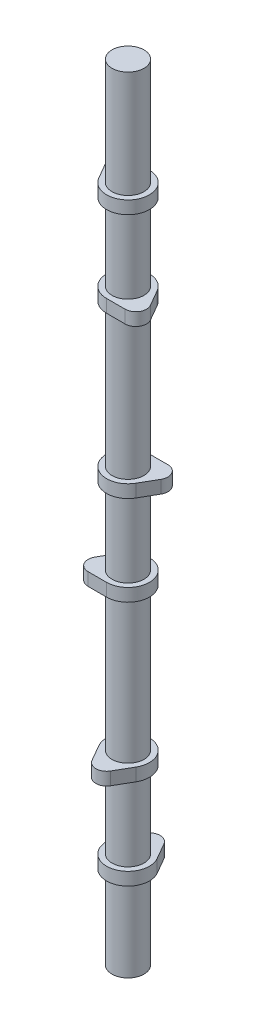
ISO-10303-21;
HEADER;
FILE_DESCRIPTION(('STEP AP214'),'2;1');
FILE_NAME('part.step','',(''),(''),'','','');
FILE_SCHEMA(('AUTOMOTIVE_DESIGN { 1 0 10303 214 1 1 1 1 }'));
ENDSEC;
DATA;
#1=APPLICATION_CONTEXT('core data for automotive mechanical design processes');
#2=APPLICATION_PROTOCOL_DEFINITION('international standard','automotive_design',2000,#1);
#3=PRODUCT_CONTEXT('',#1,'mechanical');
#4=PRODUCT('Part','Part','',(#3));
#5=PRODUCT_RELATED_PRODUCT_CATEGORY('part','',(#4));
#6=PRODUCT_DEFINITION_FORMATION('','',#4);
#7=PRODUCT_DEFINITION_CONTEXT('part definition',#1,'design');
#8=PRODUCT_DEFINITION('design','',#6,#7);
#9=PRODUCT_DEFINITION_SHAPE('','',#8);
#10=(LENGTH_UNIT() NAMED_UNIT(*) SI_UNIT(.MILLI.,.METRE.));
#11=(NAMED_UNIT(*) PLANE_ANGLE_UNIT() SI_UNIT($,.RADIAN.));
#12=(NAMED_UNIT(*) SI_UNIT($,.STERADIAN.) SOLID_ANGLE_UNIT());
#13=UNCERTAINTY_MEASURE_WITH_UNIT(LENGTH_MEASURE(1.E-05),#10,'distance_accuracy_value','');
#14=(GEOMETRIC_REPRESENTATION_CONTEXT(3) GLOBAL_UNCERTAINTY_ASSIGNED_CONTEXT((#13)) GLOBAL_UNIT_ASSIGNED_CONTEXT((#10,
#11,#12)) REPRESENTATION_CONTEXT('',''));
#15=CARTESIAN_POINT('',(0.,0.,0.));
#16=DIRECTION('',(0.,0.,1.));
#17=DIRECTION('',(1.,0.,0.));
#18=AXIS2_PLACEMENT_3D('',#15,#16,#17);
#19=CARTESIAN_POINT('',(0.,412.75,0.));
#20=DIRECTION('',(0.,-1.,0.));
#21=DIRECTION('',(0.,0.,-1.));
#22=AXIS2_PLACEMENT_3D('',#19,#20,#21);
#23=CYLINDRICAL_SURFACE('',#22,9.5);
#24=CARTESIAN_POINT('',(0.,295.91,0.));
#25=DIRECTION('',(0.,1.,0.));
#26=DIRECTION('',(0.,0.,1.));
#27=AXIS2_PLACEMENT_3D('',#24,#25,#26);
#28=CIRCLE('',#27,9.5);
#29=CARTESIAN_POINT('',(0.,295.91,9.5));
#30=VERTEX_POINT('',#29);
#31=EDGE_CURVE('E293',#30,#30,#28,.T.);
#32=ORIENTED_EDGE('',*,*,#31,.T.);
#33=EDGE_LOOP('',(#32));
#34=FACE_BOUND('',#33,.T.);
#35=CARTESIAN_POINT('',(0.,341.63,0.));
#36=DIRECTION('',(0.,1.,0.));
#37=DIRECTION('',(0.,0.,1.));
#38=AXIS2_PLACEMENT_3D('',#35,#36,#37);
#39=CIRCLE('',#38,9.5);
#40=CARTESIAN_POINT('',(0.,341.63,9.5));
#41=VERTEX_POINT('',#40);
#42=EDGE_CURVE('E11',#41,#41,#39,.T.);
#43=ORIENTED_EDGE('',*,*,#42,.F.);
#44=EDGE_LOOP('',(#43));
#45=FACE_BOUND('',#44,.T.);
#46=ADVANCED_FACE('F41',(#34,#45),#23,.T.);
#47=CARTESIAN_POINT('',(0.,203.2,0.));
#48=DIRECTION('',(0.,1.,0.));
#49=DIRECTION('',(0.,0.,1.));
#50=AXIS2_PLACEMENT_3D('',#47,#48,#49);
#51=CIRCLE('',#50,9.5);
#52=CARTESIAN_POINT('',(0.,203.2,9.5));
#53=VERTEX_POINT('',#52);
#54=EDGE_CURVE('E336',#53,#53,#51,.T.);
#55=ORIENTED_EDGE('',*,*,#54,.T.);
#56=EDGE_LOOP('',(#55));
#57=FACE_BOUND('',#56,.T.);
#58=CARTESIAN_POINT('',(0.,288.29,0.));
#59=DIRECTION('',(0.,1.,0.));
#60=DIRECTION('',(0.,0.,1.));
#61=AXIS2_PLACEMENT_3D('',#58,#59,#60);
#62=CIRCLE('',#61,9.5);
#63=CARTESIAN_POINT('',(0.,288.29,9.5));
#64=VERTEX_POINT('',#63);
#65=EDGE_CURVE('E52',#64,#64,#62,.T.);
#66=ORIENTED_EDGE('',*,*,#65,.F.);
#67=EDGE_LOOP('',(#66));
#68=FACE_BOUND('',#67,.T.);
#69=ADVANCED_FACE('F535',(#57,#68),#23,.T.);
#70=CARTESIAN_POINT('',(0.,149.86,0.));
#71=DIRECTION('',(0.,1.,0.));
#72=DIRECTION('',(0.,0.,1.));
#73=AXIS2_PLACEMENT_3D('',#70,#71,#72);
#74=CIRCLE('',#73,9.5);
#75=CARTESIAN_POINT('',(0.,149.86,9.5));
#76=VERTEX_POINT('',#75);
#77=EDGE_CURVE('E379',#76,#76,#74,.T.);
#78=ORIENTED_EDGE('',*,*,#77,.T.);
#79=EDGE_LOOP('',(#78));
#80=FACE_BOUND('',#79,.T.);
#81=CARTESIAN_POINT('',(0.,195.58,0.));
#82=DIRECTION('',(0.,1.,0.));
#83=DIRECTION('',(0.,0.,1.));
#84=AXIS2_PLACEMENT_3D('',#81,#82,#83);
#85=CIRCLE('',#84,9.5);
#86=CARTESIAN_POINT('',(0.,195.58,9.5));
#87=VERTEX_POINT('',#86);
#88=EDGE_CURVE('E483',#87,#87,#85,.T.);
#89=ORIENTED_EDGE('',*,*,#88,.F.);
#90=EDGE_LOOP('',(#89));
#91=FACE_BOUND('',#90,.T.);
#92=ADVANCED_FACE('F541',(#80,#91),#23,.T.);
#93=CARTESIAN_POINT('',(0.,57.15,0.));
#94=DIRECTION('',(0.,1.,0.));
#95=DIRECTION('',(0.,0.,1.));
#96=AXIS2_PLACEMENT_3D('',#93,#94,#95);
#97=CIRCLE('',#96,9.5);
#98=CARTESIAN_POINT('',(0.,57.15,9.5));
#99=VERTEX_POINT('',#98);
#100=EDGE_CURVE('E422',#99,#99,#97,.T.);
#101=ORIENTED_EDGE('',*,*,#100,.T.);
#102=EDGE_LOOP('',(#101));
#103=FACE_BOUND('',#102,.T.);
#104=CARTESIAN_POINT('',(0.,142.24,0.));
#105=DIRECTION('',(0.,1.,0.));
#106=DIRECTION('',(0.,0.,1.));
#107=AXIS2_PLACEMENT_3D('',#104,#105,#106);
#108=CIRCLE('',#107,9.5);
#109=CARTESIAN_POINT('',(0.,142.24,9.5));
#110=VERTEX_POINT('',#109);
#111=EDGE_CURVE('E476',#110,#110,#108,.T.);
#112=ORIENTED_EDGE('',*,*,#111,.F.);
#113=EDGE_LOOP('',(#112));
#114=FACE_BOUND('',#113,.T.);
#115=ADVANCED_FACE('F572',(#103,#114),#23,.T.);
#116=CARTESIAN_POINT('',(0.,3.80999999999998,0.));
#117=DIRECTION('',(0.,1.,0.));
#118=DIRECTION('',(0.,0.,1.));
#119=AXIS2_PLACEMENT_3D('',#116,#117,#118);
#120=CIRCLE('',#119,9.5);
#121=CARTESIAN_POINT('',(0.,3.80999999999998,9.5));
#122=VERTEX_POINT('',#121);
#123=EDGE_CURVE('E427',#122,#122,#120,.F.);
#124=ORIENTED_EDGE('',*,*,#123,.F.);
#125=EDGE_LOOP('',(#124));
#126=FACE_BOUND('',#125,.T.);
#127=CARTESIAN_POINT('',(0.,49.53,0.));
#128=DIRECTION('',(0.,1.,0.));
#129=DIRECTION('',(0.,0.,1.));
#130=AXIS2_PLACEMENT_3D('',#127,#128,#129);
#131=CIRCLE('',#130,9.5);
#132=CARTESIAN_POINT('',(0.,49.53,9.5));
#133=VERTEX_POINT('',#132);
#134=EDGE_CURVE('E472',#133,#133,#131,.T.);
#135=ORIENTED_EDGE('',*,*,#134,.F.);
#136=EDGE_LOOP('',(#135));
#137=FACE_BOUND('',#136,.T.);
#138=ADVANCED_FACE('F560',(#126,#137),#23,.T.);
#139=CARTESIAN_POINT('',(0.,3.81,-12.7));
#140=DIRECTION('',(0.,-1.,0.));
#141=DIRECTION('',(0.,0.,-1.));
#142=AXIS2_PLACEMENT_3D('',#139,#140,#141);
#143=CYLINDRICAL_SURFACE('',#142,6.35);
#144=CARTESIAN_POINT('',(0.,-3.81,-12.7));
#145=DIRECTION('',(0.,1.,0.));
#146=DIRECTION('',(0.,0.,1.));
#147=AXIS2_PLACEMENT_3D('',#144,#145,#146);
#148=CIRCLE('',#147,6.35);
#149=CARTESIAN_POINT('',(5.49926131403118,-3.81,-15.875));
#150=VERTEX_POINT('',#149);
#151=CARTESIAN_POINT('',(-5.49926131403118,-3.81,-15.875));
#152=VERTEX_POINT('',#151);
#153=EDGE_CURVE('E435',#150,#152,#148,.T.);
#154=ORIENTED_EDGE('',*,*,#153,.T.);
#155=DIRECTION('',(0.,-1.,0.));
#156=VECTOR('',#155,1.);
#157=CARTESIAN_POINT('',(-5.49926131403118,3.81,-15.875));
#158=LINE('',#157,#156);
#159=CARTESIAN_POINT('',(-5.49926131403118,3.81,-15.875));
#160=VERTEX_POINT('',#159);
#161=EDGE_CURVE('E465',#160,#152,#158,.T.);
#162=ORIENTED_EDGE('',*,*,#161,.F.);
#163=CARTESIAN_POINT('',(0.,3.81,-12.7));
#164=DIRECTION('',(0.,1.,0.));
#165=DIRECTION('',(0.,0.,1.));
#166=AXIS2_PLACEMENT_3D('',#163,#164,#165);
#167=CIRCLE('',#166,6.35);
#168=CARTESIAN_POINT('',(5.49926131403118,3.81,-15.875));
#169=VERTEX_POINT('',#168);
#170=EDGE_CURVE('E436',#169,#160,#167,.T.);
#171=ORIENTED_EDGE('',*,*,#170,.F.);
#172=DIRECTION('',(0.,-1.,0.));
#173=VECTOR('',#172,1.);
#174=CARTESIAN_POINT('',(5.49926131403118,3.81,-15.875));
#175=LINE('',#174,#173);
#176=EDGE_CURVE('E446',#169,#150,#175,.T.);
#177=ORIENTED_EDGE('',*,*,#176,.T.);
#178=EDGE_LOOP('',(#154,#162,#171,#177));
#179=FACE_BOUND('',#178,.T.);
#180=ADVANCED_FACE('F43',(#179),#143,.T.);
#181=CARTESIAN_POINT('',(-5.49926131403118,3.81,-15.875));
#182=DIRECTION('',(0.866025403784439,0.,0.5));
#183=DIRECTION('',(0.5,0.,-0.866025403784439));
#184=AXIS2_PLACEMENT_3D('',#181,#182,#183);
#185=PLANE('',#184);
#186=DIRECTION('',(-0.5,0.,0.866025403784439));
#187=VECTOR('',#186,1.);
#188=CARTESIAN_POINT('',(-5.49926131403118,-3.81,-15.875));
#189=LINE('',#188,#187);
#190=CARTESIAN_POINT('',(-10.9985226280624,-3.81,-6.35));
#191=VERTEX_POINT('',#190);
#192=EDGE_CURVE('E450',#152,#191,#189,.T.);
#193=ORIENTED_EDGE('',*,*,#192,.T.);
#194=DIRECTION('',(0.,-1.,0.));
#195=VECTOR('',#194,1.);
#196=CARTESIAN_POINT('',(-10.9985226280624,3.81,-6.35));
#197=LINE('',#196,#195);
#198=CARTESIAN_POINT('',(-10.9985226280624,3.81,-6.35));
#199=VERTEX_POINT('',#198);
#200=EDGE_CURVE('E462',#199,#191,#197,.T.);
#201=ORIENTED_EDGE('',*,*,#200,.F.);
#202=DIRECTION('',(-0.5,0.,0.866025403784439));
#203=VECTOR('',#202,1.);
#204=CARTESIAN_POINT('',(-5.49926131403118,3.81,-15.875));
#205=LINE('',#204,#203);
#206=EDGE_CURVE('E92',#160,#199,#205,.T.);
#207=ORIENTED_EDGE('',*,*,#206,.F.);
#208=ORIENTED_EDGE('',*,*,#161,.T.);
#209=EDGE_LOOP('',(#193,#201,#207,#208));
#210=FACE_BOUND('',#209,.T.);
#211=ADVANCED_FACE('F578',(#210),#185,.F.);
#212=CARTESIAN_POINT('',(0.,3.81,0.));
#213=DIRECTION('',(0.,-1.,0.));
#214=DIRECTION('',(0.,0.,-1.));
#215=AXIS2_PLACEMENT_3D('',#212,#213,#214);
#216=CYLINDRICAL_SURFACE('',#215,12.7);
#217=CARTESIAN_POINT('',(0.,-3.81,0.));
#218=DIRECTION('',(0.,1.,0.));
#219=DIRECTION('',(0.,0.,1.));
#220=AXIS2_PLACEMENT_3D('',#217,#218,#219);
#221=CIRCLE('',#220,12.7);
#222=CARTESIAN_POINT('',(10.9985226280624,-3.81,-6.34999999999999));
#223=VERTEX_POINT('',#222);
#224=EDGE_CURVE('E78',#191,#223,#221,.T.);
#225=ORIENTED_EDGE('',*,*,#224,.T.);
#226=DIRECTION('',(0.,-1.,0.));
#227=VECTOR('',#226,1.);
#228=CARTESIAN_POINT('',(10.9985226280624,3.81,-6.34999999999999));
#229=LINE('',#228,#227);
#230=CARTESIAN_POINT('',(10.9985226280624,3.81,-6.34999999999999));
#231=VERTEX_POINT('',#230);
#232=EDGE_CURVE('E459',#231,#223,#229,.T.);
#233=ORIENTED_EDGE('',*,*,#232,.F.);
#234=CARTESIAN_POINT('',(0.,3.81,0.));
#235=DIRECTION('',(0.,1.,0.));
#236=DIRECTION('',(0.,0.,1.));
#237=AXIS2_PLACEMENT_3D('',#234,#235,#236);
#238=CIRCLE('',#237,12.7);
#239=EDGE_CURVE('E441',#199,#231,#238,.T.);
#240=ORIENTED_EDGE('',*,*,#239,.F.);
#241=ORIENTED_EDGE('',*,*,#200,.T.);
#242=EDGE_LOOP('',(#225,#233,#240,#241));
#243=FACE_BOUND('',#242,.T.);
#244=ADVANCED_FACE('F910',(#243),#216,.T.);
#245=CARTESIAN_POINT('',(5.49926131403118,3.81,-15.875));
#246=DIRECTION('',(-0.866025403784439,0.,0.5));
#247=DIRECTION('',(0.5,0.,0.866025403784439));
#248=AXIS2_PLACEMENT_3D('',#245,#246,#247);
#249=PLANE('',#248);
#250=DIRECTION('',(-0.5,0.,-0.866025403784439));
#251=VECTOR('',#250,1.);
#252=CARTESIAN_POINT('',(5.49926131403118,-3.81,-15.875));
#253=LINE('',#252,#251);
#254=EDGE_CURVE('E84',#223,#150,#253,.T.);
#255=ORIENTED_EDGE('',*,*,#254,.T.);
#256=ORIENTED_EDGE('',*,*,#176,.F.);
#257=DIRECTION('',(-0.5,0.,-0.866025403784439));
#258=VECTOR('',#257,1.);
#259=CARTESIAN_POINT('',(5.49926131403118,3.81,-15.875));
#260=LINE('',#259,#258);
#261=EDGE_CURVE('E60',#231,#169,#260,.T.);
#262=ORIENTED_EDGE('',*,*,#261,.F.);
#263=ORIENTED_EDGE('',*,*,#232,.T.);
#264=EDGE_LOOP('',(#255,#256,#262,#263));
#265=FACE_BOUND('',#264,.T.);
#266=ADVANCED_FACE('F904',(#265),#249,.F.);
#267=CARTESIAN_POINT('',(0.,3.81,-12.7));
#268=DIRECTION('',(0.,1.,0.));
#269=DIRECTION('',(0.,0.,1.));
#270=AXIS2_PLACEMENT_3D('',#267,#268,#269);
#271=PLANE('',#270);
#272=ORIENTED_EDGE('',*,*,#123,.T.);
#273=EDGE_LOOP('',(#272));
#274=FACE_BOUND('',#273,.T.);
#275=ORIENTED_EDGE('',*,*,#170,.T.);
#276=ORIENTED_EDGE('',*,*,#206,.T.);
#277=ORIENTED_EDGE('',*,*,#239,.T.);
#278=ORIENTED_EDGE('',*,*,#261,.T.);
#279=EDGE_LOOP('',(#275,#276,#277,#278));
#280=FACE_BOUND('',#279,.T.);
#281=ADVANCED_FACE('F909',(#274,#280),#271,.T.);
#282=CARTESIAN_POINT('',(0.,-3.81,-12.7));
#283=DIRECTION('',(0.,1.,0.));
#284=DIRECTION('',(0.,0.,1.));
#285=AXIS2_PLACEMENT_3D('',#282,#283,#284);
#286=PLANE('',#285);
#287=CARTESIAN_POINT('',(0.,-3.80999999999998,0.));
#288=DIRECTION('',(0.,1.,0.));
#289=DIRECTION('',(0.,0.,1.));
#290=AXIS2_PLACEMENT_3D('',#287,#288,#289);
#291=CIRCLE('',#290,9.5);
#292=CARTESIAN_POINT('',(0.,-3.80999999999998,9.5));
#293=VERTEX_POINT('',#292);
#294=EDGE_CURVE('E468',#293,#293,#291,.F.);
#295=ORIENTED_EDGE('',*,*,#294,.F.);
#296=EDGE_LOOP('',(#295));
#297=FACE_BOUND('',#296,.T.);
#298=ORIENTED_EDGE('',*,*,#153,.F.);
#299=ORIENTED_EDGE('',*,*,#254,.F.);
#300=ORIENTED_EDGE('',*,*,#224,.F.);
#301=ORIENTED_EDGE('',*,*,#192,.F.);
#302=EDGE_LOOP('',(#298,#299,#300,#301));
#303=FACE_BOUND('',#302,.T.);
#304=ADVANCED_FACE('F568',(#297,#303),#286,.F.);
#305=CARTESIAN_POINT('',(0.,-53.34,0.));
#306=DIRECTION('',(0.,1.,0.));
#307=DIRECTION('',(0.,0.,1.));
#308=AXIS2_PLACEMENT_3D('',#305,#306,#307);
#309=PLANE('',#308);
#310=CARTESIAN_POINT('',(0.,-53.34,0.));
#311=DIRECTION('',(0.,1.,0.));
#312=DIRECTION('',(0.,0.,1.));
#313=AXIS2_PLACEMENT_3D('',#310,#311,#312);
#314=CIRCLE('',#313,9.5);
#315=CARTESIAN_POINT('',(0.,-53.34,9.5));
#316=VERTEX_POINT('',#315);
#317=EDGE_CURVE('E428',#316,#316,#314,.T.);
#318=ORIENTED_EDGE('',*,*,#317,.F.);
#319=EDGE_LOOP('',(#318));
#320=FACE_BOUND('',#319,.T.);
#321=ADVANCED_FACE('F558',(#320),#309,.F.);
#322=ORIENTED_EDGE('',*,*,#317,.T.);
#323=EDGE_LOOP('',(#322));
#324=FACE_BOUND('',#323,.T.);
#325=ORIENTED_EDGE('',*,*,#294,.T.);
#326=EDGE_LOOP('',(#325));
#327=FACE_BOUND('',#326,.T.);
#328=ADVANCED_FACE('F548',(#324,#327),#23,.T.);
#329=CARTESIAN_POINT('',(0.,57.15,12.7));
#330=DIRECTION('',(0.,-1.,0.));
#331=DIRECTION('',(0.,0.,1.));
#332=AXIS2_PLACEMENT_3D('',#329,#330,#331);
#333=CYLINDRICAL_SURFACE('',#332,6.35);
#334=CARTESIAN_POINT('',(0.,49.53,12.7));
#335=DIRECTION('',(0.,1.,0.));
#336=DIRECTION('',(0.,0.,-1.));
#337=AXIS2_PLACEMENT_3D('',#334,#335,#336);
#338=CIRCLE('',#337,6.35);
#339=CARTESIAN_POINT('',(-5.49926131403129,49.53,15.875));
#340=VERTEX_POINT('',#339);
#341=CARTESIAN_POINT('',(5.49926131403107,49.53,15.875));
#342=VERTEX_POINT('',#341);
#343=EDGE_CURVE('E395',#340,#342,#338,.T.);
#344=ORIENTED_EDGE('',*,*,#343,.T.);
#345=DIRECTION('',(0.,-1.,0.));
#346=VECTOR('',#345,1.);
#347=CARTESIAN_POINT('',(5.49926131403107,57.15,15.875));
#348=LINE('',#347,#346);
#349=CARTESIAN_POINT('',(5.49926131403107,57.15,15.875));
#350=VERTEX_POINT('',#349);
#351=EDGE_CURVE('E418',#350,#342,#348,.T.);
#352=ORIENTED_EDGE('',*,*,#351,.F.);
#353=CARTESIAN_POINT('',(0.,57.15,12.7));
#354=DIRECTION('',(0.,1.,0.));
#355=DIRECTION('',(0.,0.,-1.));
#356=AXIS2_PLACEMENT_3D('',#353,#354,#355);
#357=CIRCLE('',#356,6.35);
#358=CARTESIAN_POINT('',(-5.49926131403129,57.15,15.875));
#359=VERTEX_POINT('',#358);
#360=EDGE_CURVE('E380',#359,#350,#357,.T.);
#361=ORIENTED_EDGE('',*,*,#360,.F.);
#362=DIRECTION('',(0.,-1.,0.));
#363=VECTOR('',#362,1.);
#364=CARTESIAN_POINT('',(-5.49926131403129,57.15,15.875));
#365=LINE('',#364,#363);
#366=EDGE_CURVE('E394',#359,#340,#365,.T.);
#367=ORIENTED_EDGE('',*,*,#366,.T.);
#368=EDGE_LOOP('',(#344,#352,#361,#367));
#369=FACE_BOUND('',#368,.T.);
#370=ADVANCED_FACE('F557',(#369),#333,.T.);
#371=CARTESIAN_POINT('',(5.49926131403107,57.15,15.875));
#372=DIRECTION('',(-0.866025403784435,0.,-0.500000000000006));
#373=DIRECTION('',(-0.500000000000006,0.,0.866025403784435));
#374=AXIS2_PLACEMENT_3D('',#371,#372,#373);
#375=PLANE('',#374);
#376=DIRECTION('',(0.500000000000006,0.,-0.866025403784435));
#377=VECTOR('',#376,1.);
#378=CARTESIAN_POINT('',(5.49926131403107,49.53,15.875));
#379=LINE('',#378,#377);
#380=CARTESIAN_POINT('',(10.9985226280623,49.53,6.35000000000007));
#381=VERTEX_POINT('',#380);
#382=EDGE_CURVE('E399',#342,#381,#379,.T.);
#383=ORIENTED_EDGE('',*,*,#382,.T.);
#384=DIRECTION('',(0.,-1.,0.));
#385=VECTOR('',#384,1.);
#386=CARTESIAN_POINT('',(10.9985226280623,57.15,6.35000000000007));
#387=LINE('',#386,#385);
#388=CARTESIAN_POINT('',(10.9985226280623,57.15,6.35000000000007));
#389=VERTEX_POINT('',#388);
#390=EDGE_CURVE('E414',#389,#381,#387,.T.);
#391=ORIENTED_EDGE('',*,*,#390,.F.);
#392=DIRECTION('',(0.500000000000006,0.,-0.866025403784435));
#393=VECTOR('',#392,1.);
#394=CARTESIAN_POINT('',(5.49926131403107,57.15,15.875));
#395=LINE('',#394,#393);
#396=EDGE_CURVE('E384',#350,#389,#395,.T.);
#397=ORIENTED_EDGE('',*,*,#396,.F.);
#398=ORIENTED_EDGE('',*,*,#351,.T.);
#399=EDGE_LOOP('',(#383,#391,#397,#398));
#400=FACE_BOUND('',#399,.T.);
#401=ADVANCED_FACE('F565',(#400),#375,.F.);
#402=CARTESIAN_POINT('',(0.,57.15,0.));
#403=DIRECTION('',(0.,-1.,0.));
#404=DIRECTION('',(0.,0.,1.));
#405=AXIS2_PLACEMENT_3D('',#402,#403,#404);
#406=CYLINDRICAL_SURFACE('',#405,12.7);
#407=CARTESIAN_POINT('',(0.,49.53,0.));
#408=DIRECTION('',(0.,1.,0.));
#409=DIRECTION('',(0.,0.,-1.));
#410=AXIS2_PLACEMENT_3D('',#407,#408,#409);
#411=CIRCLE('',#410,12.7);
#412=CARTESIAN_POINT('',(-10.9985226280624,49.53,6.34999999999991));
#413=VERTEX_POINT('',#412);
#414=EDGE_CURVE('E402',#381,#413,#411,.T.);
#415=ORIENTED_EDGE('',*,*,#414,.T.);
#416=DIRECTION('',(0.,-1.,0.));
#417=VECTOR('',#416,1.);
#418=CARTESIAN_POINT('',(-10.9985226280624,57.15,6.34999999999991));
#419=LINE('',#418,#417);
#420=CARTESIAN_POINT('',(-10.9985226280624,57.15,6.34999999999991));
#421=VERTEX_POINT('',#420);
#422=EDGE_CURVE('E410',#421,#413,#419,.T.);
#423=ORIENTED_EDGE('',*,*,#422,.F.);
#424=CARTESIAN_POINT('',(0.,57.15,0.));
#425=DIRECTION('',(0.,1.,0.));
#426=DIRECTION('',(0.,0.,-1.));
#427=AXIS2_PLACEMENT_3D('',#424,#425,#426);
#428=CIRCLE('',#427,12.7);
#429=EDGE_CURVE('E388',#389,#421,#428,.T.);
#430=ORIENTED_EDGE('',*,*,#429,.F.);
#431=ORIENTED_EDGE('',*,*,#390,.T.);
#432=EDGE_LOOP('',(#415,#423,#430,#431));
#433=FACE_BOUND('',#432,.T.);
#434=ADVANCED_FACE('F603',(#433),#406,.T.);
#435=CARTESIAN_POINT('',(-5.49926131403129,57.15,15.875));
#436=DIRECTION('',(0.866025403784442,0.,-0.499999999999994));
#437=DIRECTION('',(-0.499999999999994,0.,-0.866025403784442));
#438=AXIS2_PLACEMENT_3D('',#435,#436,#437);
#439=PLANE('',#438);
#440=DIRECTION('',(0.499999999999994,0.,0.866025403784442));
#441=VECTOR('',#440,1.);
#442=CARTESIAN_POINT('',(-5.49926131403129,49.53,15.875));
#443=LINE('',#442,#441);
#444=EDGE_CURVE('E385',#413,#340,#443,.T.);
#445=ORIENTED_EDGE('',*,*,#444,.T.);
#446=ORIENTED_EDGE('',*,*,#366,.F.);
#447=DIRECTION('',(0.499999999999994,0.,0.866025403784442));
#448=VECTOR('',#447,1.);
#449=CARTESIAN_POINT('',(-5.49926131403129,57.15,15.875));
#450=LINE('',#449,#448);
#451=EDGE_CURVE('E391',#421,#359,#450,.T.);
#452=ORIENTED_EDGE('',*,*,#451,.F.);
#453=ORIENTED_EDGE('',*,*,#422,.T.);
#454=EDGE_LOOP('',(#445,#446,#452,#453));
#455=FACE_BOUND('',#454,.T.);
#456=ADVANCED_FACE('F599',(#455),#439,.F.);
#457=CARTESIAN_POINT('',(0.,57.15,12.7));
#458=DIRECTION('',(0.,1.,0.));
#459=DIRECTION('',(0.,0.,-1.));
#460=AXIS2_PLACEMENT_3D('',#457,#458,#459);
#461=PLANE('',#460);
#462=ORIENTED_EDGE('',*,*,#100,.F.);
#463=EDGE_LOOP('',(#462));
#464=FACE_BOUND('',#463,.T.);
#465=ORIENTED_EDGE('',*,*,#360,.T.);
#466=ORIENTED_EDGE('',*,*,#396,.T.);
#467=ORIENTED_EDGE('',*,*,#429,.T.);
#468=ORIENTED_EDGE('',*,*,#451,.T.);
#469=EDGE_LOOP('',(#465,#466,#467,#468));
#470=FACE_BOUND('',#469,.T.);
#471=ADVANCED_FACE('F589',(#464,#470),#461,.T.);
#472=CARTESIAN_POINT('',(0.,49.53,12.7));
#473=DIRECTION('',(0.,1.,0.));
#474=DIRECTION('',(0.,0.,-1.));
#475=AXIS2_PLACEMENT_3D('',#472,#473,#474);
#476=PLANE('',#475);
#477=ORIENTED_EDGE('',*,*,#134,.T.);
#478=EDGE_LOOP('',(#477));
#479=FACE_BOUND('',#478,.T.);
#480=ORIENTED_EDGE('',*,*,#343,.F.);
#481=ORIENTED_EDGE('',*,*,#444,.F.);
#482=ORIENTED_EDGE('',*,*,#414,.F.);
#483=ORIENTED_EDGE('',*,*,#382,.F.);
#484=EDGE_LOOP('',(#480,#481,#482,#483));
#485=FACE_BOUND('',#484,.T.);
#486=ADVANCED_FACE('F585',(#479,#485),#476,.F.);
#487=CARTESIAN_POINT('',(-10.9985226280623,149.86,6.35000000000005));
#488=DIRECTION('',(0.,-1.,0.));
#489=DIRECTION('',(-0.866025403784436,0.,0.500000000000004));
#490=AXIS2_PLACEMENT_3D('',#487,#488,#489);
#491=CYLINDRICAL_SURFACE('',#490,6.35);
#492=CARTESIAN_POINT('',(-10.9985226280623,142.24,6.35000000000005));
#493=DIRECTION('',(0.,1.,0.));
#494=DIRECTION('',(0.866025403784436,0.,-0.500000000000004));
#495=AXIS2_PLACEMENT_3D('',#492,#493,#494);
#496=CIRCLE('',#495,6.35);
#497=CARTESIAN_POINT('',(-16.4977839420935,142.24,3.17500000000008));
#498=VERTEX_POINT('',#497);
#499=CARTESIAN_POINT('',(-10.9985226280623,142.24,12.7000000000001));
#500=VERTEX_POINT('',#499);
#501=EDGE_CURVE('E352',#498,#500,#496,.T.);
#502=ORIENTED_EDGE('',*,*,#501,.T.);
#503=DIRECTION('',(0.,-1.,0.));
#504=VECTOR('',#503,1.);
#505=CARTESIAN_POINT('',(-10.9985226280623,149.86,12.7000000000001));
#506=LINE('',#505,#504);
#507=CARTESIAN_POINT('',(-10.9985226280623,149.86,12.7000000000001));
#508=VERTEX_POINT('',#507);
#509=EDGE_CURVE('E375',#508,#500,#506,.T.);
#510=ORIENTED_EDGE('',*,*,#509,.F.);
#511=CARTESIAN_POINT('',(-10.9985226280623,149.86,6.35000000000005));
#512=DIRECTION('',(0.,1.,0.));
#513=DIRECTION('',(0.866025403784436,0.,-0.500000000000004));
#514=AXIS2_PLACEMENT_3D('',#511,#512,#513);
#515=CIRCLE('',#514,6.35);
#516=CARTESIAN_POINT('',(-16.4977839420935,149.86,3.17500000000008));
#517=VERTEX_POINT('',#516);
#518=EDGE_CURVE('E337',#517,#508,#515,.T.);
#519=ORIENTED_EDGE('',*,*,#518,.F.);
#520=DIRECTION('',(0.,-1.,0.));
#521=VECTOR('',#520,1.);
#522=CARTESIAN_POINT('',(-16.4977839420935,149.86,3.17500000000008));
#523=LINE('',#522,#521);
#524=EDGE_CURVE('E351',#517,#498,#523,.T.);
#525=ORIENTED_EDGE('',*,*,#524,.T.);
#526=EDGE_LOOP('',(#502,#510,#519,#525));
#527=FACE_BOUND('',#526,.T.);
#528=ADVANCED_FACE('F588',(#527),#491,.T.);
#529=CARTESIAN_POINT('',(-10.9985226280623,149.86,12.7000000000001));
#530=DIRECTION('',(0.,0.,-1.));
#531=DIRECTION('',(-1.,0.,0.));
#532=AXIS2_PLACEMENT_3D('',#529,#530,#531);
#533=PLANE('',#532);
#534=DIRECTION('',(1.,0.,0.));
#535=VECTOR('',#534,1.);
#536=CARTESIAN_POINT('',(-10.9985226280623,142.24,12.7000000000001));
#537=LINE('',#536,#535);
#538=CARTESIAN_POINT('',(0.,142.24,12.7));
#539=VERTEX_POINT('',#538);
#540=EDGE_CURVE('E356',#500,#539,#537,.T.);
#541=ORIENTED_EDGE('',*,*,#540,.T.);
#542=DIRECTION('',(0.,-1.,0.));
#543=VECTOR('',#542,1.);
#544=CARTESIAN_POINT('',(0.,149.86,12.7));
#545=LINE('',#544,#543);
#546=CARTESIAN_POINT('',(0.,149.86,12.7));
#547=VERTEX_POINT('',#546);
#548=EDGE_CURVE('E371',#547,#539,#545,.T.);
#549=ORIENTED_EDGE('',*,*,#548,.F.);
#550=DIRECTION('',(1.,0.,0.));
#551=VECTOR('',#550,1.);
#552=CARTESIAN_POINT('',(-10.9985226280623,149.86,12.7000000000001));
#553=LINE('',#552,#551);
#554=EDGE_CURVE('E341',#508,#547,#553,.T.);
#555=ORIENTED_EDGE('',*,*,#554,.F.);
#556=ORIENTED_EDGE('',*,*,#509,.T.);
#557=EDGE_LOOP('',(#541,#549,#555,#556));
#558=FACE_BOUND('',#557,.T.);
#559=ADVANCED_FACE('F652',(#558),#533,.F.);
#560=CARTESIAN_POINT('',(0.,149.86,0.));
#561=DIRECTION('',(0.,-1.,0.));
#562=DIRECTION('',(-0.866025403784436,0.,0.500000000000004));
#563=AXIS2_PLACEMENT_3D('',#560,#561,#562);
#564=CYLINDRICAL_SURFACE('',#563,12.7);
#565=CARTESIAN_POINT('',(0.,142.24,0.));
#566=DIRECTION('',(0.,1.,0.));
#567=DIRECTION('',(0.866025403784436,0.,-0.500000000000004));
#568=AXIS2_PLACEMENT_3D('',#565,#566,#567);
#569=CIRCLE('',#568,12.7);
#570=CARTESIAN_POINT('',(-10.9985226280624,142.24,-6.34999999999996));
#571=VERTEX_POINT('',#570);
#572=EDGE_CURVE('E359',#539,#571,#569,.T.);
#573=ORIENTED_EDGE('',*,*,#572,.T.);
#574=DIRECTION('',(0.,-1.,0.));
#575=VECTOR('',#574,1.);
#576=CARTESIAN_POINT('',(-10.9985226280624,149.86,-6.34999999999996));
#577=LINE('',#576,#575);
#578=CARTESIAN_POINT('',(-10.9985226280624,149.86,-6.34999999999996));
#579=VERTEX_POINT('',#578);
#580=EDGE_CURVE('E367',#579,#571,#577,.T.);
#581=ORIENTED_EDGE('',*,*,#580,.F.);
#582=CARTESIAN_POINT('',(0.,149.86,0.));
#583=DIRECTION('',(0.,1.,0.));
#584=DIRECTION('',(0.866025403784436,0.,-0.500000000000004));
#585=AXIS2_PLACEMENT_3D('',#582,#583,#584);
#586=CIRCLE('',#585,12.7);
#587=EDGE_CURVE('E345',#547,#579,#586,.T.);
#588=ORIENTED_EDGE('',*,*,#587,.F.);
#589=ORIENTED_EDGE('',*,*,#548,.T.);
#590=EDGE_LOOP('',(#573,#581,#588,#589));
#591=FACE_BOUND('',#590,.T.);
#592=ADVANCED_FACE('F661',(#591),#564,.T.);
#593=CARTESIAN_POINT('',(-16.4977839420935,149.86,3.17500000000008));
#594=DIRECTION('',(0.866025403784441,0.,0.499999999999996));
#595=DIRECTION('',(0.499999999999996,0.,-0.866025403784441));
#596=AXIS2_PLACEMENT_3D('',#593,#594,#595);
#597=PLANE('',#596);
#598=DIRECTION('',(-0.499999999999996,0.,0.866025403784441));
#599=VECTOR('',#598,1.);
#600=CARTESIAN_POINT('',(-16.4977839420935,142.24,3.17500000000008));
#601=LINE('',#600,#599);
#602=EDGE_CURVE('E342',#571,#498,#601,.T.);
#603=ORIENTED_EDGE('',*,*,#602,.T.);
#604=ORIENTED_EDGE('',*,*,#524,.F.);
#605=DIRECTION('',(-0.499999999999996,0.,0.866025403784441));
#606=VECTOR('',#605,1.);
#607=CARTESIAN_POINT('',(-16.4977839420935,149.86,3.17500000000008));
#608=LINE('',#607,#606);
#609=EDGE_CURVE('E348',#579,#517,#608,.T.);
#610=ORIENTED_EDGE('',*,*,#609,.F.);
#611=ORIENTED_EDGE('',*,*,#580,.T.);
#612=EDGE_LOOP('',(#603,#604,#610,#611));
#613=FACE_BOUND('',#612,.T.);
#614=ADVANCED_FACE('F670',(#613),#597,.F.);
#615=CARTESIAN_POINT('',(-10.9985226280623,149.86,6.35000000000005));
#616=DIRECTION('',(0.,1.,0.));
#617=DIRECTION('',(0.866025403784436,0.,-0.500000000000004));
#618=AXIS2_PLACEMENT_3D('',#615,#616,#617);
#619=PLANE('',#618);
#620=ORIENTED_EDGE('',*,*,#77,.F.);
#621=EDGE_LOOP('',(#620));
#622=FACE_BOUND('',#621,.T.);
#623=ORIENTED_EDGE('',*,*,#518,.T.);
#624=ORIENTED_EDGE('',*,*,#554,.T.);
#625=ORIENTED_EDGE('',*,*,#587,.T.);
#626=ORIENTED_EDGE('',*,*,#609,.T.);
#627=EDGE_LOOP('',(#623,#624,#625,#626));
#628=FACE_BOUND('',#627,.T.);
#629=ADVANCED_FACE('F680',(#622,#628),#619,.T.);
#630=CARTESIAN_POINT('',(-10.9985226280623,142.24,6.35000000000005));
#631=DIRECTION('',(0.,1.,0.));
#632=DIRECTION('',(0.866025403784436,0.,-0.500000000000004));
#633=AXIS2_PLACEMENT_3D('',#630,#631,#632);
#634=PLANE('',#633);
#635=ORIENTED_EDGE('',*,*,#111,.T.);
#636=EDGE_LOOP('',(#635));
#637=FACE_BOUND('',#636,.T.);
#638=ORIENTED_EDGE('',*,*,#501,.F.);
#639=ORIENTED_EDGE('',*,*,#602,.F.);
#640=ORIENTED_EDGE('',*,*,#572,.F.);
#641=ORIENTED_EDGE('',*,*,#540,.F.);
#642=EDGE_LOOP('',(#638,#639,#640,#641));
#643=FACE_BOUND('',#642,.T.);
#644=ADVANCED_FACE('F690',(#637,#643),#634,.F.);
#645=CARTESIAN_POINT('',(10.9985226280624,203.2,-6.34999999999997));
#646=DIRECTION('',(0.,-1.,0.));
#647=DIRECTION('',(0.86602540378444,0.,-0.499999999999998));
#648=AXIS2_PLACEMENT_3D('',#645,#646,#647);
#649=CYLINDRICAL_SURFACE('',#648,6.35);
#650=CARTESIAN_POINT('',(10.9985226280624,195.58,-6.34999999999997));
#651=DIRECTION('',(0.,1.,0.));
#652=DIRECTION('',(-0.86602540378444,0.,0.499999999999998));
#653=AXIS2_PLACEMENT_3D('',#650,#651,#652);
#654=CIRCLE('',#653,6.35);
#655=CARTESIAN_POINT('',(16.4977839420936,195.58,-3.17499999999996));
#656=VERTEX_POINT('',#655);
#657=CARTESIAN_POINT('',(10.9985226280624,195.58,-12.7));
#658=VERTEX_POINT('',#657);
#659=EDGE_CURVE('E309',#656,#658,#654,.T.);
#660=ORIENTED_EDGE('',*,*,#659,.T.);
#661=DIRECTION('',(0.,-1.,0.));
#662=VECTOR('',#661,1.);
#663=CARTESIAN_POINT('',(10.9985226280624,203.2,-12.7));
#664=LINE('',#663,#662);
#665=CARTESIAN_POINT('',(10.9985226280624,203.2,-12.7));
#666=VERTEX_POINT('',#665);
#667=EDGE_CURVE('E332',#666,#658,#664,.T.);
#668=ORIENTED_EDGE('',*,*,#667,.F.);
#669=CARTESIAN_POINT('',(10.9985226280624,203.2,-6.34999999999997));
#670=DIRECTION('',(0.,1.,0.));
#671=DIRECTION('',(-0.86602540378444,0.,0.499999999999998));
#672=AXIS2_PLACEMENT_3D('',#669,#670,#671);
#673=CIRCLE('',#672,6.35);
#674=CARTESIAN_POINT('',(16.4977839420936,203.2,-3.17499999999996));
#675=VERTEX_POINT('',#674);
#676=EDGE_CURVE('E294',#675,#666,#673,.T.);
#677=ORIENTED_EDGE('',*,*,#676,.F.);
#678=DIRECTION('',(0.,-1.,0.));
#679=VECTOR('',#678,1.);
#680=CARTESIAN_POINT('',(16.4977839420936,203.2,-3.17499999999996));
#681=LINE('',#680,#679);
#682=EDGE_CURVE('E308',#675,#656,#681,.T.);
#683=ORIENTED_EDGE('',*,*,#682,.T.);
#684=EDGE_LOOP('',(#660,#668,#677,#683));
#685=FACE_BOUND('',#684,.T.);
#686=ADVANCED_FACE('F700',(#685),#649,.T.);
#687=CARTESIAN_POINT('',(10.9985226280624,203.2,-12.7));
#688=DIRECTION('',(0.,0.,1.));
#689=DIRECTION('',(1.,0.,0.));
#690=AXIS2_PLACEMENT_3D('',#687,#688,#689);
#691=PLANE('',#690);
#692=DIRECTION('',(-1.,0.,0.));
#693=VECTOR('',#692,1.);
#694=CARTESIAN_POINT('',(10.9985226280624,195.58,-12.7));
#695=LINE('',#694,#693);
#696=CARTESIAN_POINT('',(0.,195.58,-12.7));
#697=VERTEX_POINT('',#696);
#698=EDGE_CURVE('E313',#658,#697,#695,.T.);
#699=ORIENTED_EDGE('',*,*,#698,.T.);
#700=DIRECTION('',(0.,-1.,0.));
#701=VECTOR('',#700,1.);
#702=CARTESIAN_POINT('',(0.,203.2,-12.7));
#703=LINE('',#702,#701);
#704=CARTESIAN_POINT('',(0.,203.2,-12.7));
#705=VERTEX_POINT('',#704);
#706=EDGE_CURVE('E328',#705,#697,#703,.T.);
#707=ORIENTED_EDGE('',*,*,#706,.F.);
#708=DIRECTION('',(-1.,0.,0.));
#709=VECTOR('',#708,1.);
#710=CARTESIAN_POINT('',(10.9985226280624,203.2,-12.7));
#711=LINE('',#710,#709);
#712=EDGE_CURVE('E298',#666,#705,#711,.T.);
#713=ORIENTED_EDGE('',*,*,#712,.F.);
#714=ORIENTED_EDGE('',*,*,#667,.T.);
#715=EDGE_LOOP('',(#699,#707,#713,#714));
#716=FACE_BOUND('',#715,.T.);
#717=ADVANCED_FACE('F710',(#716),#691,.F.);
#718=CARTESIAN_POINT('',(0.,203.2,0.));
#719=DIRECTION('',(0.,-1.,0.));
#720=DIRECTION('',(0.86602540378444,0.,-0.499999999999998));
#721=AXIS2_PLACEMENT_3D('',#718,#719,#720);
#722=CYLINDRICAL_SURFACE('',#721,12.7);
#723=CARTESIAN_POINT('',(0.,195.58,0.));
#724=DIRECTION('',(0.,1.,0.));
#725=DIRECTION('',(-0.86602540378444,0.,0.499999999999998));
#726=AXIS2_PLACEMENT_3D('',#723,#724,#725);
#727=CIRCLE('',#726,12.7);
#728=CARTESIAN_POINT('',(10.9985226280624,195.58,6.35000000000004));
#729=VERTEX_POINT('',#728);
#730=EDGE_CURVE('E316',#697,#729,#727,.T.);
#731=ORIENTED_EDGE('',*,*,#730,.T.);
#732=DIRECTION('',(0.,-1.,0.));
#733=VECTOR('',#732,1.);
#734=CARTESIAN_POINT('',(10.9985226280624,203.2,6.35000000000004));
#735=LINE('',#734,#733);
#736=CARTESIAN_POINT('',(10.9985226280624,203.2,6.35000000000004));
#737=VERTEX_POINT('',#736);
#738=EDGE_CURVE('E324',#737,#729,#735,.T.);
#739=ORIENTED_EDGE('',*,*,#738,.F.);
#740=CARTESIAN_POINT('',(0.,203.2,0.));
#741=DIRECTION('',(0.,1.,0.));
#742=DIRECTION('',(-0.86602540378444,0.,0.499999999999998));
#743=AXIS2_PLACEMENT_3D('',#740,#741,#742);
#744=CIRCLE('',#743,12.7);
#745=EDGE_CURVE('E302',#705,#737,#744,.T.);
#746=ORIENTED_EDGE('',*,*,#745,.F.);
#747=ORIENTED_EDGE('',*,*,#706,.T.);
#748=EDGE_LOOP('',(#731,#739,#746,#747));
#749=FACE_BOUND('',#748,.T.);
#750=ADVANCED_FACE('F720',(#749),#722,.T.);
#751=CARTESIAN_POINT('',(16.4977839420936,203.2,-3.17499999999996));
#752=DIRECTION('',(-0.866025403784437,0.,-0.500000000000002));
#753=DIRECTION('',(-0.500000000000002,0.,0.866025403784437));
#754=AXIS2_PLACEMENT_3D('',#751,#752,#753);
#755=PLANE('',#754);
#756=DIRECTION('',(0.500000000000002,0.,-0.866025403784437));
#757=VECTOR('',#756,1.);
#758=CARTESIAN_POINT('',(16.4977839420936,195.58,-3.17499999999996));
#759=LINE('',#758,#757);
#760=EDGE_CURVE('E299',#729,#656,#759,.T.);
#761=ORIENTED_EDGE('',*,*,#760,.T.);
#762=ORIENTED_EDGE('',*,*,#682,.F.);
#763=DIRECTION('',(0.500000000000002,0.,-0.866025403784437));
#764=VECTOR('',#763,1.);
#765=CARTESIAN_POINT('',(16.4977839420936,203.2,-3.17499999999996));
#766=LINE('',#765,#764);
#767=EDGE_CURVE('E305',#737,#675,#766,.T.);
#768=ORIENTED_EDGE('',*,*,#767,.F.);
#769=ORIENTED_EDGE('',*,*,#738,.T.);
#770=EDGE_LOOP('',(#761,#762,#768,#769));
#771=FACE_BOUND('',#770,.T.);
#772=ADVANCED_FACE('F730',(#771),#755,.F.);
#773=CARTESIAN_POINT('',(10.9985226280624,203.2,-6.34999999999997));
#774=DIRECTION('',(0.,1.,0.));
#775=DIRECTION('',(-0.86602540378444,0.,0.499999999999998));
#776=AXIS2_PLACEMENT_3D('',#773,#774,#775);
#777=PLANE('',#776);
#778=ORIENTED_EDGE('',*,*,#54,.F.);
#779=EDGE_LOOP('',(#778));
#780=FACE_BOUND('',#779,.T.);
#781=ORIENTED_EDGE('',*,*,#676,.T.);
#782=ORIENTED_EDGE('',*,*,#712,.T.);
#783=ORIENTED_EDGE('',*,*,#745,.T.);
#784=ORIENTED_EDGE('',*,*,#767,.T.);
#785=EDGE_LOOP('',(#781,#782,#783,#784));
#786=FACE_BOUND('',#785,.T.);
#787=ADVANCED_FACE('F740',(#780,#786),#777,.T.);
#788=CARTESIAN_POINT('',(10.9985226280624,195.58,-6.34999999999997));
#789=DIRECTION('',(0.,1.,0.));
#790=DIRECTION('',(-0.86602540378444,0.,0.499999999999998));
#791=AXIS2_PLACEMENT_3D('',#788,#789,#790);
#792=PLANE('',#791);
#793=ORIENTED_EDGE('',*,*,#88,.T.);
#794=EDGE_LOOP('',(#793));
#795=FACE_BOUND('',#794,.T.);
#796=ORIENTED_EDGE('',*,*,#659,.F.);
#797=ORIENTED_EDGE('',*,*,#760,.F.);
#798=ORIENTED_EDGE('',*,*,#730,.F.);
#799=ORIENTED_EDGE('',*,*,#698,.F.);
#800=EDGE_LOOP('',(#796,#797,#798,#799));
#801=FACE_BOUND('',#800,.T.);
#802=ADVANCED_FACE('F750',(#795,#801),#792,.F.);
#803=CARTESIAN_POINT('',(10.9985226280624,295.91,6.3499999999999));
#804=DIRECTION('',(0.,-1.,0.));
#805=DIRECTION('',(0.866025403784443,0.,0.499999999999992));
#806=AXIS2_PLACEMENT_3D('',#803,#804,#805);
#807=CYLINDRICAL_SURFACE('',#806,6.35);
#808=CARTESIAN_POINT('',(10.9985226280624,288.29,6.3499999999999));
#809=DIRECTION('',(0.,1.,0.));
#810=DIRECTION('',(-0.866025403784443,0.,-0.499999999999992));
#811=AXIS2_PLACEMENT_3D('',#808,#809,#810);
#812=CIRCLE('',#811,6.35);
#813=CARTESIAN_POINT('',(10.9985226280625,288.29,12.6999999999999));
#814=VERTEX_POINT('',#813);
#815=CARTESIAN_POINT('',(16.4977839420936,288.29,3.17499999999985));
#816=VERTEX_POINT('',#815);
#817=EDGE_CURVE('E247',#814,#816,#812,.T.);
#818=ORIENTED_EDGE('',*,*,#817,.T.);
#819=DIRECTION('',(0.,-1.,0.));
#820=VECTOR('',#819,1.);
#821=CARTESIAN_POINT('',(16.4977839420936,295.91,3.17499999999985));
#822=LINE('',#821,#820);
#823=CARTESIAN_POINT('',(16.4977839420936,295.91,3.17499999999985));
#824=VERTEX_POINT('',#823);
#825=EDGE_CURVE('E289',#824,#816,#822,.T.);
#826=ORIENTED_EDGE('',*,*,#825,.F.);
#827=CARTESIAN_POINT('',(10.9985226280624,295.91,6.3499999999999));
#828=DIRECTION('',(0.,1.,0.));
#829=DIRECTION('',(-0.866025403784443,0.,-0.499999999999992));
#830=AXIS2_PLACEMENT_3D('',#827,#828,#829);
#831=CIRCLE('',#830,6.35);
#832=CARTESIAN_POINT('',(10.9985226280625,295.91,12.6999999999999));
#833=VERTEX_POINT('',#832);
#834=EDGE_CURVE('E252',#833,#824,#831,.T.);
#835=ORIENTED_EDGE('',*,*,#834,.F.);
#836=DIRECTION('',(0.,-1.,0.));
#837=VECTOR('',#836,1.);
#838=CARTESIAN_POINT('',(10.9985226280625,295.91,12.6999999999999));
#839=LINE('',#838,#837);
#840=EDGE_CURVE('E266',#833,#814,#839,.T.);
#841=ORIENTED_EDGE('',*,*,#840,.T.);
#842=EDGE_LOOP('',(#818,#826,#835,#841));
#843=FACE_BOUND('',#842,.T.);
#844=ADVANCED_FACE('F514',(#843),#807,.T.);
#845=CARTESIAN_POINT('',(16.4977839420936,295.91,3.17499999999985));
#846=DIRECTION('',(-0.866025403784434,0.,0.500000000000008));
#847=DIRECTION('',(0.500000000000008,0.,0.866025403784434));
#848=AXIS2_PLACEMENT_3D('',#845,#846,#847);
#849=PLANE('',#848);
#850=DIRECTION('',(-0.500000000000008,0.,-0.866025403784434));
#851=VECTOR('',#850,1.);
#852=CARTESIAN_POINT('',(16.4977839420936,288.29,3.17499999999985));
#853=LINE('',#852,#851);
#854=CARTESIAN_POINT('',(10.9985226280623,288.29,-6.3500000000001));
#855=VERTEX_POINT('',#854);
#856=EDGE_CURVE('E270',#816,#855,#853,.T.);
#857=ORIENTED_EDGE('',*,*,#856,.T.);
#858=DIRECTION('',(0.,-1.,0.));
#859=VECTOR('',#858,1.);
#860=CARTESIAN_POINT('',(10.9985226280623,295.91,-6.3500000000001));
#861=LINE('',#860,#859);
#862=CARTESIAN_POINT('',(10.9985226280623,295.91,-6.3500000000001));
#863=VERTEX_POINT('',#862);
#864=EDGE_CURVE('E285',#863,#855,#861,.T.);
#865=ORIENTED_EDGE('',*,*,#864,.F.);
#866=DIRECTION('',(-0.500000000000008,0.,-0.866025403784434));
#867=VECTOR('',#866,1.);
#868=CARTESIAN_POINT('',(16.4977839420936,295.91,3.17499999999985));
#869=LINE('',#868,#867);
#870=EDGE_CURVE('E256',#824,#863,#869,.T.);
#871=ORIENTED_EDGE('',*,*,#870,.F.);
#872=ORIENTED_EDGE('',*,*,#825,.T.);
#873=EDGE_LOOP('',(#857,#865,#871,#872));
#874=FACE_BOUND('',#873,.T.);
#875=ADVANCED_FACE('F517',(#874),#849,.F.);
#876=CARTESIAN_POINT('',(0.,295.91,0.));
#877=DIRECTION('',(0.,-1.,0.));
#878=DIRECTION('',(0.866025403784443,0.,0.499999999999992));
#879=AXIS2_PLACEMENT_3D('',#876,#877,#878);
#880=CYLINDRICAL_SURFACE('',#879,12.7);
#881=CARTESIAN_POINT('',(0.,288.29,0.));
#882=DIRECTION('',(0.,1.,0.));
#883=DIRECTION('',(-0.866025403784443,0.,-0.499999999999992));
#884=AXIS2_PLACEMENT_3D('',#881,#882,#883);
#885=CIRCLE('',#884,12.7);
#886=CARTESIAN_POINT('',(1.0842021724855E-13,288.29,12.7));
#887=VERTEX_POINT('',#886);
#888=EDGE_CURVE('E273',#855,#887,#885,.T.);
#889=ORIENTED_EDGE('',*,*,#888,.T.);
#890=DIRECTION('',(0.,-1.,0.));
#891=VECTOR('',#890,1.);
#892=CARTESIAN_POINT('',(1.0842021724855E-13,295.91,12.7));
#893=LINE('',#892,#891);
#894=CARTESIAN_POINT('',(1.0842021724855E-13,295.91,12.7));
#895=VERTEX_POINT('',#894);
#896=EDGE_CURVE('E281',#895,#887,#893,.T.);
#897=ORIENTED_EDGE('',*,*,#896,.F.);
#898=CARTESIAN_POINT('',(0.,295.91,0.));
#899=DIRECTION('',(0.,1.,0.));
#900=DIRECTION('',(-0.866025403784443,0.,-0.499999999999992));
#901=AXIS2_PLACEMENT_3D('',#898,#899,#900);
#902=CIRCLE('',#901,12.7);
#903=EDGE_CURVE('E260',#863,#895,#902,.T.);
#904=ORIENTED_EDGE('',*,*,#903,.F.);
#905=ORIENTED_EDGE('',*,*,#864,.T.);
#906=EDGE_LOOP('',(#889,#897,#904,#905));
#907=FACE_BOUND('',#906,.T.);
#908=ADVANCED_FACE('F522',(#907),#880,.T.);
#909=CARTESIAN_POINT('',(10.9985226280625,295.91,12.6999999999999));
#910=DIRECTION('',(0.,0.,-1.));
#911=DIRECTION('',(-1.,0.,0.));
#912=AXIS2_PLACEMENT_3D('',#909,#910,#911);
#913=PLANE('',#912);
#914=DIRECTION('',(1.,0.,0.));
#915=VECTOR('',#914,1.);
#916=CARTESIAN_POINT('',(10.9985226280625,288.29,12.6999999999999));
#917=LINE('',#916,#915);
#918=EDGE_CURVE('E257',#887,#814,#917,.T.);
#919=ORIENTED_EDGE('',*,*,#918,.T.);
#920=ORIENTED_EDGE('',*,*,#840,.F.);
#921=DIRECTION('',(1.,0.,0.));
#922=VECTOR('',#921,1.);
#923=CARTESIAN_POINT('',(10.9985226280625,295.91,12.6999999999999));
#924=LINE('',#923,#922);
#925=EDGE_CURVE('E263',#895,#833,#924,.T.);
#926=ORIENTED_EDGE('',*,*,#925,.F.);
#927=ORIENTED_EDGE('',*,*,#896,.T.);
#928=EDGE_LOOP('',(#919,#920,#926,#927));
#929=FACE_BOUND('',#928,.T.);
#930=ADVANCED_FACE('F506',(#929),#913,.F.);
#931=CARTESIAN_POINT('',(10.9985226280624,295.91,6.3499999999999));
#932=DIRECTION('',(0.,1.,0.));
#933=DIRECTION('',(-0.866025403784443,0.,-0.499999999999992));
#934=AXIS2_PLACEMENT_3D('',#931,#932,#933);
#935=PLANE('',#934);
#936=ORIENTED_EDGE('',*,*,#31,.F.);
#937=EDGE_LOOP('',(#936));
#938=FACE_BOUND('',#937,.T.);
#939=ORIENTED_EDGE('',*,*,#834,.T.);
#940=ORIENTED_EDGE('',*,*,#870,.T.);
#941=ORIENTED_EDGE('',*,*,#903,.T.);
#942=ORIENTED_EDGE('',*,*,#925,.T.);
#943=EDGE_LOOP('',(#939,#940,#941,#942));
#944=FACE_BOUND('',#943,.T.);
#945=ADVANCED_FACE('F502',(#938,#944),#935,.T.);
#946=CARTESIAN_POINT('',(10.9985226280624,288.29,6.3499999999999));
#947=DIRECTION('',(0.,1.,0.));
#948=DIRECTION('',(-0.866025403784443,0.,-0.499999999999992));
#949=AXIS2_PLACEMENT_3D('',#946,#947,#948);
#950=PLANE('',#949);
#951=ORIENTED_EDGE('',*,*,#65,.T.);
#952=EDGE_LOOP('',(#951));
#953=FACE_BOUND('',#952,.T.);
#954=ORIENTED_EDGE('',*,*,#817,.F.);
#955=ORIENTED_EDGE('',*,*,#918,.F.);
#956=ORIENTED_EDGE('',*,*,#888,.F.);
#957=ORIENTED_EDGE('',*,*,#856,.F.);
#958=EDGE_LOOP('',(#954,#955,#956,#957));
#959=FACE_BOUND('',#958,.T.);
#960=ADVANCED_FACE('F505',(#953,#959),#950,.F.);
#961=CARTESIAN_POINT('',(-10.9985226280624,349.25,-6.34999999999997));
#962=DIRECTION('',(0.,-1.,0.));
#963=DIRECTION('',(-0.86602540378444,0.,-0.499999999999998));
#964=AXIS2_PLACEMENT_3D('',#961,#962,#963);
#965=CYLINDRICAL_SURFACE('',#964,6.35);
#966=CARTESIAN_POINT('',(-10.9985226280624,341.63,-6.34999999999997));
#967=DIRECTION('',(0.,1.,0.));
#968=DIRECTION('',(0.86602540378444,0.,0.499999999999998));
#969=AXIS2_PLACEMENT_3D('',#966,#967,#968);
#970=CIRCLE('',#969,6.35);
#971=CARTESIAN_POINT('',(-10.9985226280624,341.63,-12.7));
#972=VERTEX_POINT('',#971);
#973=CARTESIAN_POINT('',(-16.4977839420936,341.63,-3.17499999999996));
#974=VERTEX_POINT('',#973);
#975=EDGE_CURVE('E241',#972,#974,#970,.T.);
#976=ORIENTED_EDGE('',*,*,#975,.T.);
#977=DIRECTION('',(0.,-1.,0.));
#978=VECTOR('',#977,1.);
#979=CARTESIAN_POINT('',(-16.4977839420936,349.25,-3.17499999999996));
#980=LINE('',#979,#978);
#981=CARTESIAN_POINT('',(-16.4977839420936,349.25,-3.17499999999996));
#982=VERTEX_POINT('',#981);
#983=EDGE_CURVE('E219',#982,#974,#980,.T.);
#984=ORIENTED_EDGE('',*,*,#983,.F.);
#985=CARTESIAN_POINT('',(-10.9985226280624,349.25,-6.34999999999997));
#986=DIRECTION('',(0.,1.,0.));
#987=DIRECTION('',(0.86602540378444,0.,0.499999999999998));
#988=AXIS2_PLACEMENT_3D('',#985,#986,#987);
#989=CIRCLE('',#988,6.35);
#990=CARTESIAN_POINT('',(-10.9985226280624,349.25,-12.7));
#991=VERTEX_POINT('',#990);
#992=EDGE_CURVE('E227',#991,#982,#989,.T.);
#993=ORIENTED_EDGE('',*,*,#992,.F.);
#994=DIRECTION('',(0.,-1.,0.));
#995=VECTOR('',#994,1.);
#996=CARTESIAN_POINT('',(-10.9985226280624,349.25,-12.7));
#997=LINE('',#996,#995);
#998=EDGE_CURVE('E1012',#991,#972,#997,.T.);
#999=ORIENTED_EDGE('',*,*,#998,.T.);
#1000=EDGE_LOOP('',(#976,#984,#993,#999));
#1001=FACE_BOUND('',#1000,.T.);
#1002=ADVANCED_FACE('F239',(#1001),#965,.T.);
#1003=CARTESIAN_POINT('',(-16.4977839420936,349.25,-3.17499999999996));
#1004=DIRECTION('',(0.866025403784437,0.,-0.500000000000002));
#1005=DIRECTION('',(-0.500000000000002,0.,-0.866025403784437));
#1006=AXIS2_PLACEMENT_3D('',#1003,#1004,#1005);
#1007=PLANE('',#1006);
#1008=DIRECTION('',(0.500000000000002,0.,0.866025403784437));
#1009=VECTOR('',#1008,1.);
#1010=CARTESIAN_POINT('',(-16.4977839420936,341.63,-3.17499999999996));
#1011=LINE('',#1010,#1009);
#1012=CARTESIAN_POINT('',(-10.9985226280624,341.63,6.35000000000003));
#1013=VERTEX_POINT('',#1012);
#1014=EDGE_CURVE('E999',#974,#1013,#1011,.T.);
#1015=ORIENTED_EDGE('',*,*,#1014,.T.);
#1016=DIRECTION('',(0.,-1.,0.));
#1017=VECTOR('',#1016,1.);
#1018=CARTESIAN_POINT('',(-10.9985226280624,349.25,6.35000000000003));
#1019=LINE('',#1018,#1017);
#1020=CARTESIAN_POINT('',(-10.9985226280624,349.25,6.35000000000003));
#1021=VERTEX_POINT('',#1020);
#1022=EDGE_CURVE('E222',#1021,#1013,#1019,.T.);
#1023=ORIENTED_EDGE('',*,*,#1022,.F.);
#1024=DIRECTION('',(0.500000000000002,0.,0.866025403784437));
#1025=VECTOR('',#1024,1.);
#1026=CARTESIAN_POINT('',(-16.4977839420936,349.25,-3.17499999999996));
#1027=LINE('',#1026,#1025);
#1028=EDGE_CURVE('E215',#982,#1021,#1027,.T.);
#1029=ORIENTED_EDGE('',*,*,#1028,.F.);
#1030=ORIENTED_EDGE('',*,*,#983,.T.);
#1031=EDGE_LOOP('',(#1015,#1023,#1029,#1030));
#1032=FACE_BOUND('',#1031,.T.);
#1033=ADVANCED_FACE('F217',(#1032),#1007,.F.);
#1034=CARTESIAN_POINT('',(0.,349.25,0.));
#1035=DIRECTION('',(0.,-1.,0.));
#1036=DIRECTION('',(-0.86602540378444,0.,-0.499999999999998));
#1037=AXIS2_PLACEMENT_3D('',#1034,#1035,#1036);
#1038=CYLINDRICAL_SURFACE('',#1037,12.7);
#1039=CARTESIAN_POINT('',(0.,341.63,0.));
#1040=DIRECTION('',(0.,1.,0.));
#1041=DIRECTION('',(0.86602540378444,0.,0.499999999999998));
#1042=AXIS2_PLACEMENT_3D('',#1039,#1040,#1041);
#1043=CIRCLE('',#1042,12.7);
#1044=CARTESIAN_POINT('',(0.,341.63,-12.7));
#1045=VERTEX_POINT('',#1044);
#1046=EDGE_CURVE('E1003',#1013,#1045,#1043,.T.);
#1047=ORIENTED_EDGE('',*,*,#1046,.T.);
#1048=DIRECTION('',(0.,-1.,0.));
#1049=VECTOR('',#1048,1.);
#1050=CARTESIAN_POINT('',(0.,349.25,-12.7));
#1051=LINE('',#1050,#1049);
#1052=CARTESIAN_POINT('',(0.,349.25,-12.7));
#1053=VERTEX_POINT('',#1052);
#1054=EDGE_CURVE('E248',#1053,#1045,#1051,.T.);
#1055=ORIENTED_EDGE('',*,*,#1054,.F.);
#1056=CARTESIAN_POINT('',(0.,349.25,0.));
#1057=DIRECTION('',(0.,1.,0.));
#1058=DIRECTION('',(0.86602540378444,0.,0.499999999999998));
#1059=AXIS2_PLACEMENT_3D('',#1056,#1057,#1058);
#1060=CIRCLE('',#1059,12.7);
#1061=EDGE_CURVE('E226',#1021,#1053,#1060,.T.);
#1062=ORIENTED_EDGE('',*,*,#1061,.F.);
#1063=ORIENTED_EDGE('',*,*,#1022,.T.);
#1064=EDGE_LOOP('',(#1047,#1055,#1062,#1063));
#1065=FACE_BOUND('',#1064,.T.);
#1066=ADVANCED_FACE('F816',(#1065),#1038,.T.);
#1067=CARTESIAN_POINT('',(-10.9985226280624,349.25,-12.7));
#1068=DIRECTION('',(0.,0.,1.));
#1069=DIRECTION('',(1.,0.,0.));
#1070=AXIS2_PLACEMENT_3D('',#1067,#1068,#1069);
#1071=PLANE('',#1070);
#1072=DIRECTION('',(-1.,0.,0.));
#1073=VECTOR('',#1072,1.);
#1074=CARTESIAN_POINT('',(-10.9985226280624,341.63,-12.7));
#1075=LINE('',#1074,#1073);
#1076=EDGE_CURVE('E237',#1045,#972,#1075,.T.);
#1077=ORIENTED_EDGE('',*,*,#1076,.T.);
#1078=ORIENTED_EDGE('',*,*,#998,.F.);
#1079=DIRECTION('',(-1.,0.,0.));
#1080=VECTOR('',#1079,1.);
#1081=CARTESIAN_POINT('',(-10.9985226280624,349.25,-12.7));
#1082=LINE('',#1081,#1080);
#1083=EDGE_CURVE('E232',#1053,#991,#1082,.T.);
#1084=ORIENTED_EDGE('',*,*,#1083,.F.);
#1085=ORIENTED_EDGE('',*,*,#1054,.T.);
#1086=EDGE_LOOP('',(#1077,#1078,#1084,#1085));
#1087=FACE_BOUND('',#1086,.T.);
#1088=ADVANCED_FACE('F825',(#1087),#1071,.F.);
#1089=CARTESIAN_POINT('',(-10.9985226280624,349.25,-6.34999999999997));
#1090=DIRECTION('',(0.,1.,0.));
#1091=DIRECTION('',(0.86602540378444,0.,0.499999999999998));
#1092=AXIS2_PLACEMENT_3D('',#1089,#1090,#1091);
#1093=PLANE('',#1092);
#1094=CARTESIAN_POINT('',(0.,349.25,0.));
#1095=DIRECTION('',(0.,1.,0.));
#1096=DIRECTION('',(0.,0.,1.));
#1097=AXIS2_PLACEMENT_3D('',#1094,#1095,#1096);
#1098=CIRCLE('',#1097,9.5);
#1099=CARTESIAN_POINT('',(0.,349.25,9.5));
#1100=VERTEX_POINT('',#1099);
#1101=EDGE_CURVE('E45',#1100,#1100,#1098,.T.);
#1102=ORIENTED_EDGE('',*,*,#1101,.F.);
#1103=EDGE_LOOP('',(#1102));
#1104=FACE_BOUND('',#1103,.T.);
#1105=ORIENTED_EDGE('',*,*,#992,.T.);
#1106=ORIENTED_EDGE('',*,*,#1028,.T.);
#1107=ORIENTED_EDGE('',*,*,#1061,.T.);
#1108=ORIENTED_EDGE('',*,*,#1083,.T.);
#1109=EDGE_LOOP('',(#1105,#1106,#1107,#1108));
#1110=FACE_BOUND('',#1109,.T.);
#1111=ADVANCED_FACE('F230',(#1104,#1110),#1093,.T.);
#1112=CARTESIAN_POINT('',(-10.9985226280624,341.63,-6.34999999999997));
#1113=DIRECTION('',(0.,1.,0.));
#1114=DIRECTION('',(0.86602540378444,0.,0.499999999999998));
#1115=AXIS2_PLACEMENT_3D('',#1112,#1113,#1114);
#1116=PLANE('',#1115);
#1117=ORIENTED_EDGE('',*,*,#42,.T.);
#1118=EDGE_LOOP('',(#1117));
#1119=FACE_BOUND('',#1118,.T.);
#1120=ORIENTED_EDGE('',*,*,#975,.F.);
#1121=ORIENTED_EDGE('',*,*,#1076,.F.);
#1122=ORIENTED_EDGE('',*,*,#1046,.F.);
#1123=ORIENTED_EDGE('',*,*,#1014,.F.);
#1124=EDGE_LOOP('',(#1120,#1121,#1122,#1123));
#1125=FACE_BOUND('',#1124,.T.);
#1126=ADVANCED_FACE('F552',(#1119,#1125),#1116,.F.);
#1127=CARTESIAN_POINT('',(0.,412.75,0.));
#1128=DIRECTION('',(0.,1.,0.));
#1129=DIRECTION('',(0.,0.,1.));
#1130=AXIS2_PLACEMENT_3D('',#1127,#1128,#1129);
#1131=PLANE('',#1130);
#1132=CARTESIAN_POINT('',(0.,412.75,0.));
#1133=DIRECTION('',(0.,1.,0.));
#1134=DIRECTION('',(0.,0.,1.));
#1135=AXIS2_PLACEMENT_3D('',#1132,#1133,#1134);
#1136=CIRCLE('',#1135,9.5);
#1137=CARTESIAN_POINT('',(0.,412.75,9.5));
#1138=VERTEX_POINT('',#1137);
#1139=EDGE_CURVE('E423',#1138,#1138,#1136,.T.);
#1140=ORIENTED_EDGE('',*,*,#1139,.T.);
#1141=EDGE_LOOP('',(#1140));
#1142=FACE_BOUND('',#1141,.T.);
#1143=ADVANCED_FACE('F546',(#1142),#1131,.T.);
#1144=ORIENTED_EDGE('',*,*,#1101,.T.);
#1145=EDGE_LOOP('',(#1144));
#1146=FACE_BOUND('',#1145,.T.);
#1147=ORIENTED_EDGE('',*,*,#1139,.F.);
#1148=EDGE_LOOP('',(#1147));
#1149=FACE_BOUND('',#1148,.T.);
#1150=ADVANCED_FACE('F537',(#1146,#1149),#23,.T.);
#1151=CLOSED_SHELL('',(#46,#69,#92,#115,#138,#180,#211,#244,#266,#281,#304,#321,#328,#370,#401,
#434,#456,#471,#486,#528,#559,#592,#614,#629,#644,#686,#717,#750,#772,#787,#802,#844,#875,#908,
#930,#945,#960,#1002,#1033,#1066,#1088,#1111,#1126,#1143,#1150));
#1152=MANIFOLD_SOLID_BREP('B2',#1151);
#1153=ADVANCED_BREP_SHAPE_REPRESENTATION('',(#18,#1152),#14);
#1154=SHAPE_DEFINITION_REPRESENTATION(#9,#1153);
ENDSEC;
END-ISO-10303-21;
